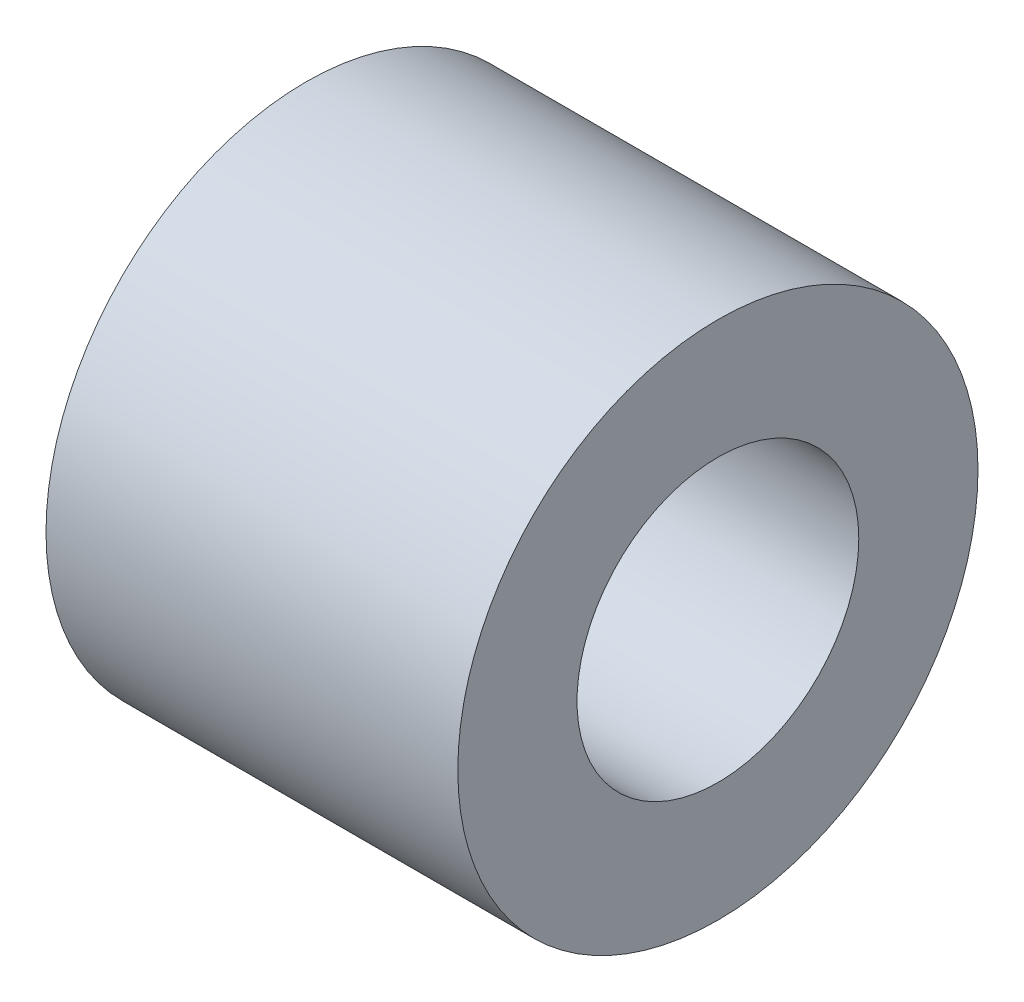
ISO-10303-21;
HEADER;
FILE_DESCRIPTION(('STEP AP214'),'2;1');
FILE_NAME('part.step','',(''),(''),'','','');
FILE_SCHEMA(('AUTOMOTIVE_DESIGN { 1 0 10303 214 1 1 1 1 }'));
ENDSEC;
DATA;
#1=APPLICATION_CONTEXT('core data for automotive mechanical design processes');
#2=APPLICATION_PROTOCOL_DEFINITION('international standard','automotive_design',2000,#1);
#3=PRODUCT_CONTEXT('',#1,'mechanical');
#4=PRODUCT('Part','Part','',(#3));
#5=PRODUCT_RELATED_PRODUCT_CATEGORY('part','',(#4));
#6=PRODUCT_DEFINITION_FORMATION('','',#4);
#7=PRODUCT_DEFINITION_CONTEXT('part definition',#1,'design');
#8=PRODUCT_DEFINITION('design','',#6,#7);
#9=PRODUCT_DEFINITION_SHAPE('','',#8);
#10=(LENGTH_UNIT() NAMED_UNIT(*) SI_UNIT(.MILLI.,.METRE.));
#11=(NAMED_UNIT(*) PLANE_ANGLE_UNIT() SI_UNIT($,.RADIAN.));
#12=(NAMED_UNIT(*) SI_UNIT($,.STERADIAN.) SOLID_ANGLE_UNIT());
#13=UNCERTAINTY_MEASURE_WITH_UNIT(LENGTH_MEASURE(1.E-05),#10,'distance_accuracy_value','');
#14=(GEOMETRIC_REPRESENTATION_CONTEXT(3) GLOBAL_UNCERTAINTY_ASSIGNED_CONTEXT((#13)) GLOBAL_UNIT_ASSIGNED_CONTEXT((#10,
#11,#12)) REPRESENTATION_CONTEXT('',''));
#15=CARTESIAN_POINT('',(0.,0.,0.));
#16=DIRECTION('',(0.,0.,1.));
#17=DIRECTION('',(1.,0.,0.));
#18=AXIS2_PLACEMENT_3D('',#15,#16,#17);
#19=CARTESIAN_POINT('',(3.8,0.,0.));
#20=DIRECTION('',(-1.,0.,0.));
#21=DIRECTION('',(0.,0.,1.));
#22=AXIS2_PLACEMENT_3D('',#19,#20,#21);
#23=CYLINDRICAL_SURFACE('',#22,2.4);
#24=CARTESIAN_POINT('',(3.8,0.,0.));
#25=DIRECTION('',(1.,0.,0.));
#26=DIRECTION('',(0.,0.,-1.));
#27=AXIS2_PLACEMENT_3D('',#24,#25,#26);
#28=CIRCLE('',#27,2.4);
#29=CARTESIAN_POINT('',(3.8,0.,2.4));
#30=VERTEX_POINT('',#29);
#31=EDGE_CURVE('E10',#30,#30,#28,.T.);
#32=CARTESIAN_POINT('',(0.,0.,0.));
#33=DIRECTION('',(1.,0.,0.));
#34=DIRECTION('',(0.,0.,-1.));
#35=AXIS2_PLACEMENT_3D('',#32,#33,#34);
#36=CIRCLE('',#35,2.4);
#37=CARTESIAN_POINT('',(0.,0.,2.4));
#38=VERTEX_POINT('',#37);
#39=EDGE_CURVE('E44',#38,#38,#36,.T.);
#40=CARTESIAN_POINT('',(3.8,0.,2.4));
#41=CARTESIAN_POINT('',(3.76041666666667,0.,2.4));
#42=CARTESIAN_POINT('',(3.72083333333333,0.,2.4));
#43=CARTESIAN_POINT('',(3.64166666666667,0.,2.4));
#44=CARTESIAN_POINT('',(3.60208333333333,0.,2.4));
#45=CARTESIAN_POINT('',(3.52291666666667,0.,2.4));
#46=CARTESIAN_POINT('',(3.48333333333333,0.,2.4));
#47=CARTESIAN_POINT('',(3.40416666666667,0.,2.4));
#48=CARTESIAN_POINT('',(3.36458333333333,0.,2.4));
#49=CARTESIAN_POINT('',(3.28541666666667,0.,2.4));
#50=CARTESIAN_POINT('',(3.24583333333333,0.,2.4));
#51=CARTESIAN_POINT('',(3.16666666666667,0.,2.4));
#52=CARTESIAN_POINT('',(3.12708333333333,0.,2.4));
#53=CARTESIAN_POINT('',(3.04791666666667,0.,2.4));
#54=CARTESIAN_POINT('',(3.00833333333333,0.,2.4));
#55=CARTESIAN_POINT('',(2.92916666666667,0.,2.4));
#56=CARTESIAN_POINT('',(2.88958333333333,0.,2.4));
#57=CARTESIAN_POINT('',(2.81041666666667,0.,2.4));
#58=CARTESIAN_POINT('',(2.77083333333333,0.,2.4));
#59=CARTESIAN_POINT('',(2.69166666666667,0.,2.4));
#60=CARTESIAN_POINT('',(2.65208333333333,0.,2.4));
#61=CARTESIAN_POINT('',(2.57291666666667,0.,2.4));
#62=CARTESIAN_POINT('',(2.53333333333333,0.,2.4));
#63=CARTESIAN_POINT('',(2.45416666666667,0.,2.4));
#64=CARTESIAN_POINT('',(2.41458333333333,0.,2.4));
#65=CARTESIAN_POINT('',(2.33541666666667,0.,2.4));
#66=CARTESIAN_POINT('',(2.29583333333333,0.,2.4));
#67=CARTESIAN_POINT('',(2.21666666666667,0.,2.4));
#68=CARTESIAN_POINT('',(2.17708333333333,0.,2.4));
#69=CARTESIAN_POINT('',(2.09791666666667,0.,2.4));
#70=CARTESIAN_POINT('',(2.05833333333333,0.,2.4));
#71=CARTESIAN_POINT('',(1.97916666666667,0.,2.4));
#72=CARTESIAN_POINT('',(1.93958333333333,0.,2.4));
#73=CARTESIAN_POINT('',(1.86041666666667,0.,2.4));
#74=CARTESIAN_POINT('',(1.82083333333333,0.,2.4));
#75=CARTESIAN_POINT('',(1.74166666666667,0.,2.4));
#76=CARTESIAN_POINT('',(1.70208333333333,0.,2.4));
#77=CARTESIAN_POINT('',(1.62291666666667,0.,2.4));
#78=CARTESIAN_POINT('',(1.58333333333333,0.,2.4));
#79=CARTESIAN_POINT('',(1.50416666666667,0.,2.4));
#80=CARTESIAN_POINT('',(1.46458333333333,0.,2.4));
#81=CARTESIAN_POINT('',(1.38541666666667,0.,2.4));
#82=CARTESIAN_POINT('',(1.34583333333333,0.,2.4));
#83=CARTESIAN_POINT('',(1.26666666666667,0.,2.4));
#84=CARTESIAN_POINT('',(1.22708333333333,0.,2.4));
#85=CARTESIAN_POINT('',(1.14791666666667,0.,2.4));
#86=CARTESIAN_POINT('',(1.10833333333333,0.,2.4));
#87=CARTESIAN_POINT('',(1.02916666666667,0.,2.4));
#88=CARTESIAN_POINT('',(0.989583333333333,0.,2.4));
#89=CARTESIAN_POINT('',(0.910416666666667,0.,2.4));
#90=CARTESIAN_POINT('',(0.870833333333333,0.,2.4));
#91=CARTESIAN_POINT('',(0.791666666666667,0.,2.4));
#92=CARTESIAN_POINT('',(0.752083333333333,0.,2.4));
#93=CARTESIAN_POINT('',(0.672916666666667,0.,2.4));
#94=CARTESIAN_POINT('',(0.633333333333333,0.,2.4));
#95=CARTESIAN_POINT('',(0.554166666666667,0.,2.4));
#96=CARTESIAN_POINT('',(0.514583333333334,0.,2.4));
#97=CARTESIAN_POINT('',(0.435416666666667,0.,2.4));
#98=CARTESIAN_POINT('',(0.395833333333333,0.,2.4));
#99=CARTESIAN_POINT('',(0.316666666666666,0.,2.4));
#100=CARTESIAN_POINT('',(0.277083333333333,0.,2.4));
#101=CARTESIAN_POINT('',(0.197916666666667,0.,2.4));
#102=CARTESIAN_POINT('',(0.158333333333333,0.,2.4));
#103=CARTESIAN_POINT('',(0.0791666666666666,0.,2.4));
#104=CARTESIAN_POINT('',(0.0395833333333333,0.,2.4));
#105=CARTESIAN_POINT('',(0.,0.,2.4));
#106=B_SPLINE_CURVE_WITH_KNOTS('',3,(#40,#41,#42,#43,#44,#45,#46,#47,#48,#49,#50,#51,#52,#53,
#54,#55,#56,#57,#58,#59,#60,#61,#62,#63,#64,#65,#66,#67,#68,#69,#70,#71,#72,#73,#74,#75,#76,#77,
#78,#79,#80,#81,#82,#83,#84,#85,#86,#87,#88,#89,#90,#91,#92,#93,#94,#95,#96,#97,#98,#99,#100,
#101,#102,#103,#104,#105),.UNSPECIFIED.,.F.,.F.,(4,2,2,2,2,2,2,2,2,2,2,2,2,2,2,2,2,2,2,2,2,2,2,
2,2,2,2,2,2,2,2,2,4),(0.,0.11875,0.2375,0.35625,0.475,0.59375,0.7125,0.831249999999999,0.95,
1.06875,1.1875,1.30625,1.425,1.54375,1.6625,1.78125,1.9,2.01875,2.1375,2.25625,2.375,2.49375,
2.6125,2.73125,2.85,2.96875,3.0875,3.20625,3.325,3.44375,3.5625,3.68125,3.8),.UNSPECIFIED.);
#107=EDGE_CURVE('BSEAM41',#30,#38,#106,.T.);
#108=ORIENTED_EDGE('',*,*,#31,.F.);
#109=ORIENTED_EDGE('',*,*,#39,.T.);
#110=ORIENTED_EDGE('',*,*,#107,.T.);
#111=ORIENTED_EDGE('',*,*,#107,.F.);
#112=EDGE_LOOP('',(#108,#110,#109,#111));
#113=FACE_BOUND('',#112,.T.);
#114=ADVANCED_FACE('F41',(#113),#23,.T.);
#115=CARTESIAN_POINT('',(3.8,0.,0.));
#116=DIRECTION('',(1.,0.,0.));
#117=DIRECTION('',(0.,0.,-1.));
#118=AXIS2_PLACEMENT_3D('',#115,#116,#117);
#119=PLANE('',#118);
#120=CARTESIAN_POINT('',(3.8,0.,0.));
#121=DIRECTION('',(1.,0.,0.));
#122=DIRECTION('',(0.,0.,-1.));
#123=AXIS2_PLACEMENT_3D('',#120,#121,#122);
#124=CIRCLE('',#123,1.3);
#125=CARTESIAN_POINT('',(3.8,0.,-1.3));
#126=VERTEX_POINT('',#125);
#127=EDGE_CURVE('E53',#126,#126,#124,.T.);
#128=ORIENTED_EDGE('',*,*,#127,.F.);
#129=EDGE_LOOP('',(#128));
#130=FACE_BOUND('',#129,.T.);
#131=ORIENTED_EDGE('',*,*,#31,.T.);
#132=EDGE_LOOP('',(#131));
#133=FACE_BOUND('',#132,.T.);
#134=ADVANCED_FACE('F68',(#130,#133),#119,.T.);
#135=CARTESIAN_POINT('',(0.,0.,0.));
#136=DIRECTION('',(1.,0.,0.));
#137=DIRECTION('',(0.,0.,-1.));
#138=AXIS2_PLACEMENT_3D('',#135,#136,#137);
#139=PLANE('',#138);
#140=CARTESIAN_POINT('',(0.,0.,0.));
#141=DIRECTION('',(1.,0.,0.));
#142=DIRECTION('',(0.,0.,-1.));
#143=AXIS2_PLACEMENT_3D('',#140,#141,#142);
#144=CIRCLE('',#143,1.3);
#145=CARTESIAN_POINT('',(0.,0.,-1.3));
#146=VERTEX_POINT('',#145);
#147=EDGE_CURVE('E51',#146,#146,#144,.T.);
#148=ORIENTED_EDGE('',*,*,#147,.T.);
#149=EDGE_LOOP('',(#148));
#150=FACE_BOUND('',#149,.T.);
#151=ORIENTED_EDGE('',*,*,#39,.F.);
#152=EDGE_LOOP('',(#151));
#153=FACE_BOUND('',#152,.T.);
#154=ADVANCED_FACE('F59',(#150,#153),#139,.F.);
#155=CARTESIAN_POINT('',(0.,0.,0.));
#156=DIRECTION('',(1.,0.,0.));
#157=DIRECTION('',(0.,0.,-1.));
#158=AXIS2_PLACEMENT_3D('',#155,#156,#157);
#159=CYLINDRICAL_SURFACE('',#158,1.3);
#160=CARTESIAN_POINT('',(0.,0.,-1.3));
#161=CARTESIAN_POINT('',(0.0395833333333333,0.,-1.3));
#162=CARTESIAN_POINT('',(0.0791666666666667,0.,-1.3));
#163=CARTESIAN_POINT('',(0.158333333333333,0.,-1.3));
#164=CARTESIAN_POINT('',(0.197916666666667,0.,-1.3));
#165=CARTESIAN_POINT('',(0.277083333333333,0.,-1.3));
#166=CARTESIAN_POINT('',(0.316666666666667,0.,-1.3));
#167=CARTESIAN_POINT('',(0.395833333333333,0.,-1.3));
#168=CARTESIAN_POINT('',(0.435416666666667,0.,-1.3));
#169=CARTESIAN_POINT('',(0.514583333333333,0.,-1.3));
#170=CARTESIAN_POINT('',(0.554166666666667,0.,-1.3));
#171=CARTESIAN_POINT('',(0.633333333333333,0.,-1.3));
#172=CARTESIAN_POINT('',(0.672916666666667,0.,-1.3));
#173=CARTESIAN_POINT('',(0.752083333333333,0.,-1.3));
#174=CARTESIAN_POINT('',(0.791666666666667,0.,-1.3));
#175=CARTESIAN_POINT('',(0.870833333333333,0.,-1.3));
#176=CARTESIAN_POINT('',(0.910416666666667,0.,-1.3));
#177=CARTESIAN_POINT('',(0.989583333333333,0.,-1.3));
#178=CARTESIAN_POINT('',(1.02916666666667,0.,-1.3));
#179=CARTESIAN_POINT('',(1.10833333333333,0.,-1.3));
#180=CARTESIAN_POINT('',(1.14791666666667,0.,-1.3));
#181=CARTESIAN_POINT('',(1.22708333333333,0.,-1.3));
#182=CARTESIAN_POINT('',(1.26666666666667,0.,-1.3));
#183=CARTESIAN_POINT('',(1.34583333333333,0.,-1.3));
#184=CARTESIAN_POINT('',(1.38541666666667,0.,-1.3));
#185=CARTESIAN_POINT('',(1.46458333333333,0.,-1.3));
#186=CARTESIAN_POINT('',(1.50416666666667,0.,-1.3));
#187=CARTESIAN_POINT('',(1.58333333333333,0.,-1.3));
#188=CARTESIAN_POINT('',(1.62291666666667,0.,-1.3));
#189=CARTESIAN_POINT('',(1.70208333333333,0.,-1.3));
#190=CARTESIAN_POINT('',(1.74166666666667,0.,-1.3));
#191=CARTESIAN_POINT('',(1.82083333333333,0.,-1.3));
#192=CARTESIAN_POINT('',(1.86041666666667,0.,-1.3));
#193=CARTESIAN_POINT('',(1.93958333333333,0.,-1.3));
#194=CARTESIAN_POINT('',(1.97916666666667,0.,-1.3));
#195=CARTESIAN_POINT('',(2.05833333333333,0.,-1.3));
#196=CARTESIAN_POINT('',(2.09791666666667,0.,-1.3));
#197=CARTESIAN_POINT('',(2.17708333333333,0.,-1.3));
#198=CARTESIAN_POINT('',(2.21666666666667,0.,-1.3));
#199=CARTESIAN_POINT('',(2.29583333333333,0.,-1.3));
#200=CARTESIAN_POINT('',(2.33541666666667,0.,-1.3));
#201=CARTESIAN_POINT('',(2.41458333333333,0.,-1.3));
#202=CARTESIAN_POINT('',(2.45416666666667,0.,-1.3));
#203=CARTESIAN_POINT('',(2.53333333333333,0.,-1.3));
#204=CARTESIAN_POINT('',(2.57291666666667,0.,-1.3));
#205=CARTESIAN_POINT('',(2.65208333333333,0.,-1.3));
#206=CARTESIAN_POINT('',(2.69166666666667,0.,-1.3));
#207=CARTESIAN_POINT('',(2.77083333333333,0.,-1.3));
#208=CARTESIAN_POINT('',(2.81041666666667,0.,-1.3));
#209=CARTESIAN_POINT('',(2.88958333333333,0.,-1.3));
#210=CARTESIAN_POINT('',(2.92916666666667,0.,-1.3));
#211=CARTESIAN_POINT('',(3.00833333333333,0.,-1.3));
#212=CARTESIAN_POINT('',(3.04791666666667,0.,-1.3));
#213=CARTESIAN_POINT('',(3.12708333333333,0.,-1.3));
#214=CARTESIAN_POINT('',(3.16666666666667,0.,-1.3));
#215=CARTESIAN_POINT('',(3.24583333333333,0.,-1.3));
#216=CARTESIAN_POINT('',(3.28541666666667,0.,-1.3));
#217=CARTESIAN_POINT('',(3.36458333333333,0.,-1.3));
#218=CARTESIAN_POINT('',(3.40416666666667,0.,-1.3));
#219=CARTESIAN_POINT('',(3.48333333333333,0.,-1.3));
#220=CARTESIAN_POINT('',(3.52291666666667,0.,-1.3));
#221=CARTESIAN_POINT('',(3.60208333333333,0.,-1.3));
#222=CARTESIAN_POINT('',(3.64166666666667,0.,-1.3));
#223=CARTESIAN_POINT('',(3.72083333333333,0.,-1.3));
#224=CARTESIAN_POINT('',(3.76041666666667,0.,-1.3));
#225=CARTESIAN_POINT('',(3.8,0.,-1.3));
#226=B_SPLINE_CURVE_WITH_KNOTS('',3,(#160,#161,#162,#163,#164,#165,#166,#167,#168,#169,#170,
#171,#172,#173,#174,#175,#176,#177,#178,#179,#180,#181,#182,#183,#184,#185,#186,#187,#188,#189,
#190,#191,#192,#193,#194,#195,#196,#197,#198,#199,#200,#201,#202,#203,#204,#205,#206,#207,#208,
#209,#210,#211,#212,#213,#214,#215,#216,#217,#218,#219,#220,#221,#222,#223,#224,#225),
.UNSPECIFIED.,.F.,.F.,(4,2,2,2,2,2,2,2,2,2,2,2,2,2,2,2,2,2,2,2,2,2,2,2,2,2,2,2,2,2,2,2,4),(0.,
0.11875,0.2375,0.35625,0.475,0.59375,0.7125,0.83125,0.95,1.06875,1.1875,1.30625,1.425,1.54375,
1.6625,1.78125,1.9,2.01875,2.1375,2.25625,2.375,2.49375,2.6125,2.73125,2.85,2.96875,3.0875,
3.20625,3.325,3.44375,3.5625,3.68125,3.8),.UNSPECIFIED.);
#227=EDGE_CURVE('BSEAM62',#146,#126,#226,.T.);
#228=ORIENTED_EDGE('',*,*,#147,.F.);
#229=ORIENTED_EDGE('',*,*,#127,.T.);
#230=ORIENTED_EDGE('',*,*,#227,.T.);
#231=ORIENTED_EDGE('',*,*,#227,.F.);
#232=EDGE_LOOP('',(#228,#230,#229,#231));
#233=FACE_BOUND('',#232,.T.);
#234=ADVANCED_FACE('F62',(#233),#159,.F.);
#235=CLOSED_SHELL('',(#114,#134,#154,#234));
#236=MANIFOLD_SOLID_BREP('B2',#235);
#237=ADVANCED_BREP_SHAPE_REPRESENTATION('',(#18,#236),#14);
#238=SHAPE_DEFINITION_REPRESENTATION(#9,#237);
ENDSEC;
END-ISO-10303-21;
